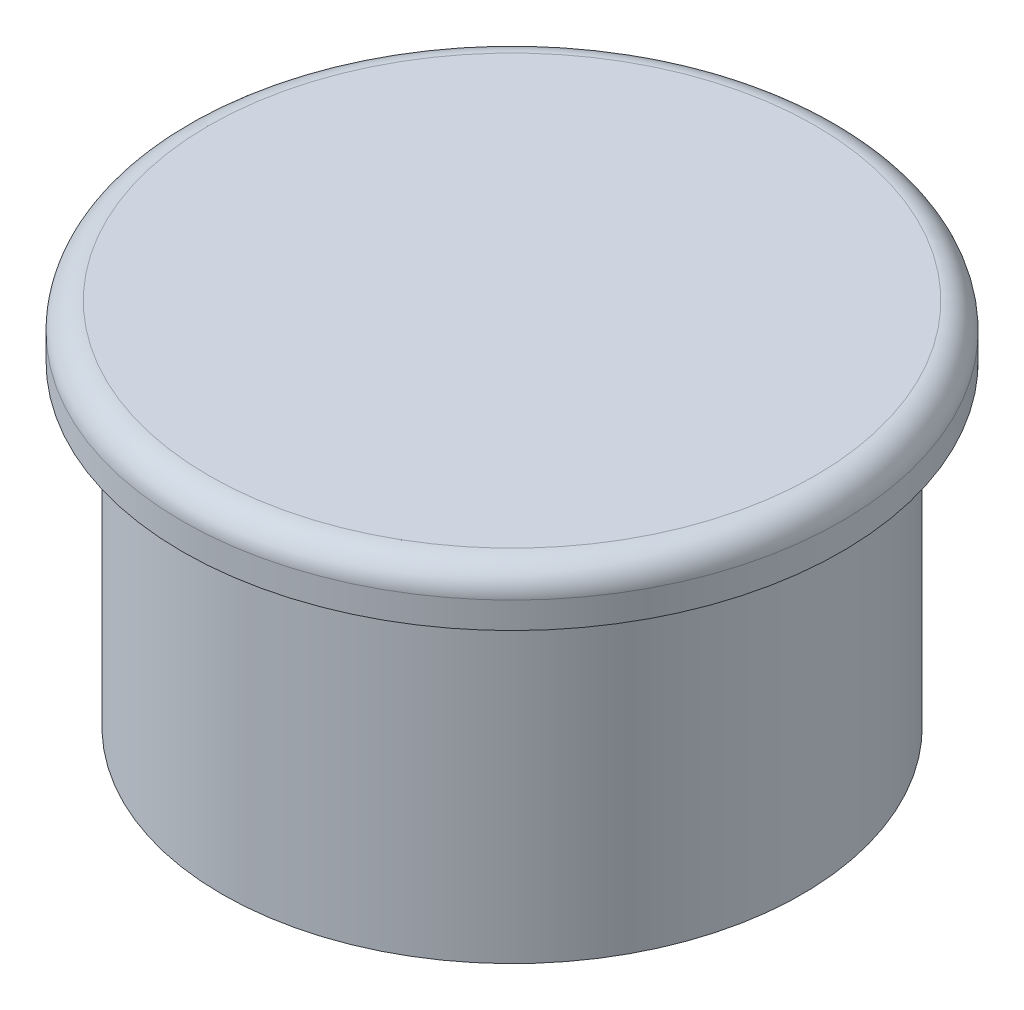
ISO-10303-21;
HEADER;
FILE_DESCRIPTION(('STEP AP214'),'2;1');
FILE_NAME('part.step','',(''),(''),'','','');
FILE_SCHEMA(('AUTOMOTIVE_DESIGN { 1 0 10303 214 1 1 1 1 }'));
ENDSEC;
DATA;
#1=APPLICATION_CONTEXT('core data for automotive mechanical design processes');
#2=APPLICATION_PROTOCOL_DEFINITION('international standard','automotive_design',2000,#1);
#3=PRODUCT_CONTEXT('',#1,'mechanical');
#4=PRODUCT('Part','Part','',(#3));
#5=PRODUCT_RELATED_PRODUCT_CATEGORY('part','',(#4));
#6=PRODUCT_DEFINITION_FORMATION('','',#4);
#7=PRODUCT_DEFINITION_CONTEXT('part definition',#1,'design');
#8=PRODUCT_DEFINITION('design','',#6,#7);
#9=PRODUCT_DEFINITION_SHAPE('','',#8);
#10=(LENGTH_UNIT() NAMED_UNIT(*) SI_UNIT(.MILLI.,.METRE.));
#11=(NAMED_UNIT(*) PLANE_ANGLE_UNIT() SI_UNIT($,.RADIAN.));
#12=(NAMED_UNIT(*) SI_UNIT($,.STERADIAN.) SOLID_ANGLE_UNIT());
#13=UNCERTAINTY_MEASURE_WITH_UNIT(LENGTH_MEASURE(1.E-05),#10,'distance_accuracy_value','');
#14=(GEOMETRIC_REPRESENTATION_CONTEXT(3) GLOBAL_UNCERTAINTY_ASSIGNED_CONTEXT((#13)) GLOBAL_UNIT_ASSIGNED_CONTEXT((#10,
#11,#12)) REPRESENTATION_CONTEXT('',''));
#15=CARTESIAN_POINT('',(0.,0.,0.));
#16=DIRECTION('',(0.,0.,1.));
#17=DIRECTION('',(1.,0.,0.));
#18=AXIS2_PLACEMENT_3D('',#15,#16,#17);
#19=CARTESIAN_POINT('',(0.,0.,0.));
#20=DIRECTION('',(0.,1.,0.));
#21=DIRECTION('',(0.,0.,1.));
#22=AXIS2_PLACEMENT_3D('',#19,#20,#21);
#23=PLANE('',#22);
#24=CARTESIAN_POINT('',(0.,0.,0.));
#25=DIRECTION('',(0.,1.,0.));
#26=DIRECTION('',(0.,0.,1.));
#27=AXIS2_PLACEMENT_3D('',#24,#25,#26);
#28=CIRCLE('',#27,11.);
#29=CARTESIAN_POINT('',(0.,0.,11.));
#30=VERTEX_POINT('',#29);
#31=EDGE_CURVE('E53',#30,#30,#28,.T.);
#32=ORIENTED_EDGE('',*,*,#31,.F.);
#33=EDGE_LOOP('',(#32));
#34=FACE_BOUND('',#33,.T.);
#35=CARTESIAN_POINT('',(0.,0.,0.));
#36=DIRECTION('',(0.,1.,0.));
#37=DIRECTION('',(0.,0.,1.));
#38=AXIS2_PLACEMENT_3D('',#35,#36,#37);
#39=CIRCLE('',#38,9.);
#40=CARTESIAN_POINT('',(0.,0.,9.));
#41=VERTEX_POINT('',#40);
#42=EDGE_CURVE('E57',#41,#41,#39,.T.);
#43=ORIENTED_EDGE('',*,*,#42,.T.);
#44=EDGE_LOOP('',(#43));
#45=FACE_BOUND('',#44,.T.);
#46=ADVANCED_FACE('F38',(#34,#45),#23,.F.);
#47=CARTESIAN_POINT('',(0.,12.,0.));
#48=DIRECTION('',(0.,-1.,0.));
#49=DIRECTION('',(0.,0.,-1.));
#50=AXIS2_PLACEMENT_3D('',#47,#48,#49);
#51=CYLINDRICAL_SURFACE('',#50,11.);
#52=CARTESIAN_POINT('',(0.,12.,0.));
#53=DIRECTION('',(0.,1.,0.));
#54=DIRECTION('',(0.,0.,1.));
#55=AXIS2_PLACEMENT_3D('',#52,#53,#54);
#56=CIRCLE('',#55,11.);
#57=CARTESIAN_POINT('',(0.,12.,11.));
#58=VERTEX_POINT('',#57);
#59=EDGE_CURVE('E49',#58,#58,#56,.T.);
#60=ORIENTED_EDGE('',*,*,#59,.F.);
#61=EDGE_LOOP('',(#60));
#62=FACE_BOUND('',#61,.T.);
#63=ORIENTED_EDGE('',*,*,#31,.T.);
#64=EDGE_LOOP('',(#63));
#65=FACE_BOUND('',#64,.T.);
#66=ADVANCED_FACE('F87',(#62,#65),#51,.T.);
#67=CARTESIAN_POINT('',(0.,12.,0.));
#68=DIRECTION('',(0.,-1.,0.));
#69=DIRECTION('',(0.,0.,-1.));
#70=AXIS2_PLACEMENT_3D('',#67,#68,#69);
#71=CYLINDRICAL_SURFACE('',#70,9.);
#72=CARTESIAN_POINT('',(0.,12.,0.));
#73=DIRECTION('',(0.,1.,0.));
#74=DIRECTION('',(0.,0.,1.));
#75=AXIS2_PLACEMENT_3D('',#72,#73,#74);
#76=CIRCLE('',#75,9.);
#77=CARTESIAN_POINT('',(0.,12.,9.));
#78=VERTEX_POINT('',#77);
#79=EDGE_CURVE('E61',#78,#78,#76,.T.);
#80=ORIENTED_EDGE('',*,*,#79,.T.);
#81=EDGE_LOOP('',(#80));
#82=FACE_BOUND('',#81,.T.);
#83=ORIENTED_EDGE('',*,*,#42,.F.);
#84=EDGE_LOOP('',(#83));
#85=FACE_BOUND('',#84,.T.);
#86=ADVANCED_FACE('F84',(#82,#85),#71,.F.);
#87=CARTESIAN_POINT('',(0.,12.,0.));
#88=DIRECTION('',(0.,1.,0.));
#89=DIRECTION('',(0.,0.,1.));
#90=AXIS2_PLACEMENT_3D('',#87,#88,#89);
#91=PLANE('',#90);
#92=ORIENTED_EDGE('',*,*,#79,.F.);
#93=EDGE_LOOP('',(#92));
#94=FACE_BOUND('',#93,.T.);
#95=ADVANCED_FACE('F75',(#94),#91,.F.);
#96=CARTESIAN_POINT('',(0.,14.,0.));
#97=DIRECTION('',(0.,-1.,0.));
#98=DIRECTION('',(0.,0.,-1.));
#99=AXIS2_PLACEMENT_3D('',#96,#97,#98);
#100=CYLINDRICAL_SURFACE('',#99,12.5);
#101=CARTESIAN_POINT('',(0.,13.,0.));
#102=DIRECTION('',(0.,1.,0.));
#103=DIRECTION('',(0.,0.,1.));
#104=AXIS2_PLACEMENT_3D('',#101,#102,#103);
#105=CIRCLE('',#104,12.5);
#106=CARTESIAN_POINT('',(0.,13.,12.5));
#107=VERTEX_POINT('',#106);
#108=EDGE_CURVE('E10',#107,#107,#105,.F.);
#109=ORIENTED_EDGE('',*,*,#108,.T.);
#110=EDGE_LOOP('',(#109));
#111=FACE_BOUND('',#110,.T.);
#112=CARTESIAN_POINT('',(0.,12.,0.));
#113=DIRECTION('',(0.,1.,0.));
#114=DIRECTION('',(0.,0.,1.));
#115=AXIS2_PLACEMENT_3D('',#112,#113,#114);
#116=CIRCLE('',#115,12.5);
#117=CARTESIAN_POINT('',(0.,12.,12.5));
#118=VERTEX_POINT('',#117);
#119=EDGE_CURVE('E64',#118,#118,#116,.T.);
#120=ORIENTED_EDGE('',*,*,#119,.T.);
#121=EDGE_LOOP('',(#120));
#122=FACE_BOUND('',#121,.T.);
#123=ADVANCED_FACE('F68',(#111,#122),#100,.T.);
#124=CARTESIAN_POINT('',(0.,14.,0.));
#125=DIRECTION('',(0.,1.,0.));
#126=DIRECTION('',(0.,0.,1.));
#127=AXIS2_PLACEMENT_3D('',#124,#125,#126);
#128=PLANE('',#127);
#129=CARTESIAN_POINT('',(0.,14.,0.));
#130=DIRECTION('',(0.,1.,0.));
#131=DIRECTION('',(0.,0.,1.));
#132=AXIS2_PLACEMENT_3D('',#129,#130,#131);
#133=CIRCLE('',#132,11.5);
#134=CARTESIAN_POINT('',(0.,14.,11.5));
#135=VERTEX_POINT('',#134);
#136=EDGE_CURVE('E45',#135,#135,#133,.T.);
#137=ORIENTED_EDGE('',*,*,#136,.T.);
#138=EDGE_LOOP('',(#137));
#139=FACE_BOUND('',#138,.T.);
#140=ADVANCED_FACE('F72',(#139),#128,.T.);
#141=ORIENTED_EDGE('',*,*,#59,.T.);
#142=EDGE_LOOP('',(#141));
#143=FACE_BOUND('',#142,.T.);
#144=ORIENTED_EDGE('',*,*,#119,.F.);
#145=EDGE_LOOP('',(#144));
#146=FACE_BOUND('',#145,.T.);
#147=ADVANCED_FACE('F70',(#143,#146),#91,.F.);
#148=CARTESIAN_POINT('',(0.,13.,0.));
#149=DIRECTION('',(0.,1.,0.));
#150=DIRECTION('',(0.,0.,1.));
#151=AXIS2_PLACEMENT_3D('',#148,#149,#150);
#152=TOROIDAL_SURFACE('',#151,11.5,1.);
#153=ORIENTED_EDGE('',*,*,#108,.F.);
#154=EDGE_LOOP('',(#153));
#155=FACE_BOUND('',#154,.T.);
#156=ORIENTED_EDGE('',*,*,#136,.F.);
#157=EDGE_LOOP('',(#156));
#158=FACE_BOUND('',#157,.T.);
#159=ADVANCED_FACE('F40',(#155,#158),#152,.T.);
#160=CLOSED_SHELL('',(#46,#66,#86,#95,#123,#140,#147,#159));
#161=MANIFOLD_SOLID_BREP('B2',#160);
#162=ADVANCED_BREP_SHAPE_REPRESENTATION('',(#18,#161),#14);
#163=SHAPE_DEFINITION_REPRESENTATION(#9,#162);
ENDSEC;
END-ISO-10303-21;
